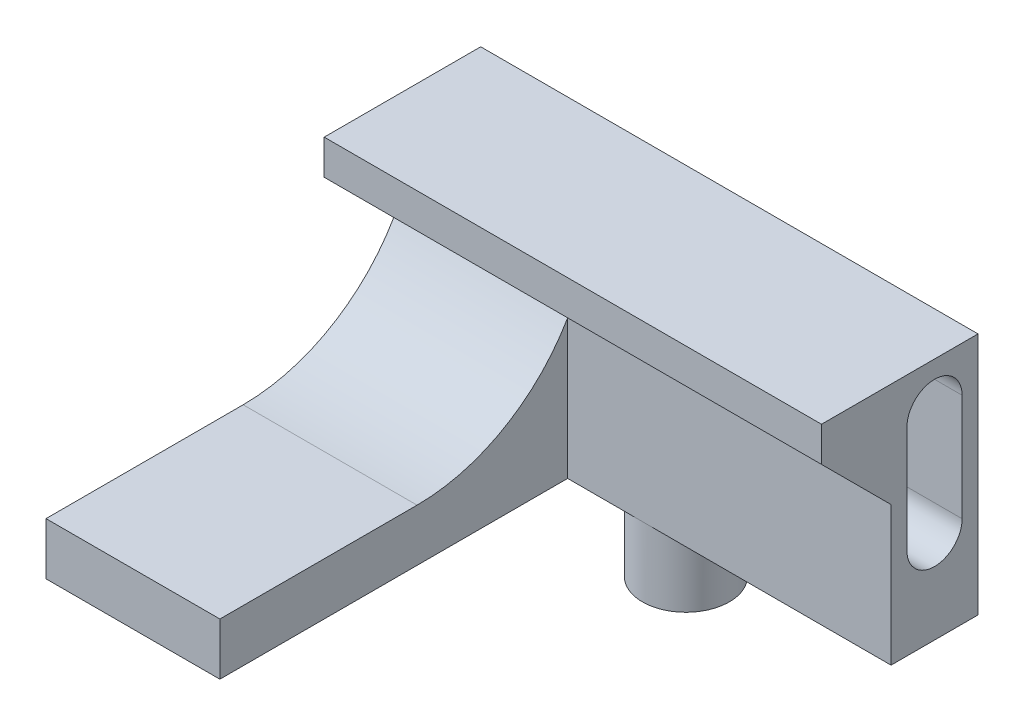
ISO-10303-21;
HEADER;
FILE_DESCRIPTION(('STEP AP214'),'2;1');
FILE_NAME('part.step','',(''),(''),'','','');
FILE_SCHEMA(('AUTOMOTIVE_DESIGN { 1 0 10303 214 1 1 1 1 }'));
ENDSEC;
DATA;
#1=APPLICATION_CONTEXT('core data for automotive mechanical design processes');
#2=APPLICATION_PROTOCOL_DEFINITION('international standard','automotive_design',2000,#1);
#3=PRODUCT_CONTEXT('',#1,'mechanical');
#4=PRODUCT('Part','Part','',(#3));
#5=PRODUCT_RELATED_PRODUCT_CATEGORY('part','',(#4));
#6=PRODUCT_DEFINITION_FORMATION('','',#4);
#7=PRODUCT_DEFINITION_CONTEXT('part definition',#1,'design');
#8=PRODUCT_DEFINITION('design','',#6,#7);
#9=PRODUCT_DEFINITION_SHAPE('','',#8);
#10=(LENGTH_UNIT() NAMED_UNIT(*) SI_UNIT(.MILLI.,.METRE.));
#11=(NAMED_UNIT(*) PLANE_ANGLE_UNIT() SI_UNIT($,.RADIAN.));
#12=(NAMED_UNIT(*) SI_UNIT($,.STERADIAN.) SOLID_ANGLE_UNIT());
#13=UNCERTAINTY_MEASURE_WITH_UNIT(LENGTH_MEASURE(1.E-05),#10,'distance_accuracy_value','');
#14=(GEOMETRIC_REPRESENTATION_CONTEXT(3) GLOBAL_UNCERTAINTY_ASSIGNED_CONTEXT((#13)) GLOBAL_UNIT_ASSIGNED_CONTEXT((#10,
#11,#12)) REPRESENTATION_CONTEXT('',''));
#15=CARTESIAN_POINT('',(0.,0.,0.));
#16=DIRECTION('',(0.,0.,1.));
#17=DIRECTION('',(1.,0.,0.));
#18=AXIS2_PLACEMENT_3D('',#15,#16,#17);
#19=CARTESIAN_POINT('',(-14.3,14.,2.5));
#20=DIRECTION('',(-1.,0.,0.));
#21=DIRECTION('',(0.,0.,1.));
#22=AXIS2_PLACEMENT_3D('',#19,#20,#21);
#23=PLANE('',#22);
#24=DIRECTION('',(0.,0.,-1.));
#25=VECTOR('',#24,1.);
#26=CARTESIAN_POINT('',(-14.3,0.,2.5));
#27=LINE('',#26,#25);
#28=CARTESIAN_POINT('',(-14.3,0.,22.5));
#29=VERTEX_POINT('',#28);
#30=CARTESIAN_POINT('',(-14.3,0.,-2.5));
#31=VERTEX_POINT('',#30);
#32=EDGE_CURVE('E273',#29,#31,#27,.T.);
#33=ORIENTED_EDGE('',*,*,#32,.F.);
#34=DIRECTION('',(0.,1.,0.));
#35=VECTOR('',#34,1.);
#36=CARTESIAN_POINT('',(-14.3,0.,22.5));
#37=LINE('',#36,#35);
#38=CARTESIAN_POINT('',(-14.3,3.,22.5));
#39=VERTEX_POINT('',#38);
#40=EDGE_CURVE('E181',#29,#39,#37,.T.);
#41=ORIENTED_EDGE('',*,*,#40,.T.);
#42=DIRECTION('',(0.,0.,-1.));
#43=VECTOR('',#42,1.);
#44=CARTESIAN_POINT('',(-14.3,3.,22.5));
#45=LINE('',#44,#43);
#46=CARTESIAN_POINT('',(-14.3,3.,11.1602540378444));
#47=VERTEX_POINT('',#46);
#48=EDGE_CURVE('E165',#39,#47,#45,.T.);
#49=ORIENTED_EDGE('',*,*,#48,.T.);
#50=CARTESIAN_POINT('',(-14.3,13.,11.1602540378444));
#51=DIRECTION('',(-1.,0.,0.));
#52=DIRECTION('',(0.,0.,1.));
#53=AXIS2_PLACEMENT_3D('',#50,#51,#52);
#54=CIRCLE('',#53,10.);
#55=CARTESIAN_POINT('',(-14.3,7.99999999999996,2.5));
#56=VERTEX_POINT('',#55);
#57=EDGE_CURVE('E41',#47,#56,#54,.F.);
#58=ORIENTED_EDGE('',*,*,#57,.T.);
#59=DIRECTION('',(0.,-0.707106781186551,-0.707106781186544));
#60=VECTOR('',#59,1.);
#61=CARTESIAN_POINT('',(-14.3,12.,6.5));
#62=LINE('',#61,#60);
#63=CARTESIAN_POINT('',(-14.3,12.,6.5));
#64=VERTEX_POINT('',#63);
#65=EDGE_CURVE('E226',#64,#56,#62,.T.);
#66=ORIENTED_EDGE('',*,*,#65,.F.);
#67=DIRECTION('',(0.,-1.,0.));
#68=VECTOR('',#67,1.);
#69=CARTESIAN_POINT('',(-14.3,14.,6.5));
#70=LINE('',#69,#68);
#71=CARTESIAN_POINT('',(-14.3,14.,6.5));
#72=VERTEX_POINT('',#71);
#73=EDGE_CURVE('E231',#72,#64,#70,.T.);
#74=ORIENTED_EDGE('',*,*,#73,.F.);
#75=DIRECTION('',(0.,0.,-1.));
#76=VECTOR('',#75,1.);
#77=CARTESIAN_POINT('',(-14.3,14.,2.5));
#78=LINE('',#77,#76);
#79=CARTESIAN_POINT('',(-14.3,14.,-2.5));
#80=VERTEX_POINT('',#79);
#81=EDGE_CURVE('E280',#72,#80,#78,.T.);
#82=ORIENTED_EDGE('',*,*,#81,.T.);
#83=DIRECTION('',(0.,-1.,0.));
#84=VECTOR('',#83,1.);
#85=CARTESIAN_POINT('',(-14.3,14.,-2.5));
#86=LINE('',#85,#84);
#87=EDGE_CURVE('E289',#80,#31,#86,.T.);
#88=ORIENTED_EDGE('',*,*,#87,.T.);
#89=EDGE_LOOP('',(#33,#41,#49,#58,#66,#74,#82,#88));
#90=FACE_BOUND('',#89,.T.);
#91=DIRECTION('',(0.,-1.,0.));
#92=VECTOR('',#91,1.);
#93=CARTESIAN_POINT('',(-14.3,5.25,1.5875));
#94=LINE('',#93,#92);
#95=CARTESIAN_POINT('',(-14.3,11.4,1.5875));
#96=VERTEX_POINT('',#95);
#97=CARTESIAN_POINT('',(-14.3,5.25,1.5875));
#98=VERTEX_POINT('',#97);
#99=EDGE_CURVE('E202',#96,#98,#94,.T.);
#100=ORIENTED_EDGE('',*,*,#99,.T.);
#101=CARTESIAN_POINT('',(-14.3,5.25,0.));
#102=DIRECTION('',(1.,0.,0.));
#103=DIRECTION('',(0.,0.,-1.));
#104=AXIS2_PLACEMENT_3D('',#101,#102,#103);
#105=CIRCLE('',#104,1.5875);
#106=CARTESIAN_POINT('',(-14.3,5.25,-1.5875));
#107=VERTEX_POINT('',#106);
#108=EDGE_CURVE('E187',#98,#107,#105,.T.);
#109=ORIENTED_EDGE('',*,*,#108,.T.);
#110=DIRECTION('',(0.,1.,0.));
#111=VECTOR('',#110,1.);
#112=CARTESIAN_POINT('',(-14.3,5.25,-1.5875));
#113=LINE('',#112,#111);
#114=CARTESIAN_POINT('',(-14.3,11.4,-1.5875));
#115=VERTEX_POINT('',#114);
#116=EDGE_CURVE('E193',#107,#115,#113,.T.);
#117=ORIENTED_EDGE('',*,*,#116,.T.);
#118=CARTESIAN_POINT('',(-14.3,11.4,0.));
#119=DIRECTION('',(1.,0.,0.));
#120=DIRECTION('',(0.,0.,-1.));
#121=AXIS2_PLACEMENT_3D('',#118,#119,#120);
#122=CIRCLE('',#121,1.5875);
#123=EDGE_CURVE('E205',#115,#96,#122,.T.);
#124=ORIENTED_EDGE('',*,*,#123,.T.);
#125=EDGE_LOOP('',(#100,#109,#117,#124));
#126=FACE_BOUND('',#125,.T.);
#127=ADVANCED_FACE('F33',(#90,#126),#23,.T.);
#128=CARTESIAN_POINT('',(0.,0.,0.));
#129=DIRECTION('',(0.,-1.,0.));
#130=DIRECTION('',(0.,0.,-1.));
#131=AXIS2_PLACEMENT_3D('',#128,#129,#130);
#132=PLANE('',#131);
#133=CARTESIAN_POINT('',(0.,0.,0.));
#134=DIRECTION('',(0.,-1.,0.));
#135=DIRECTION('',(0.,0.,-1.));
#136=AXIS2_PLACEMENT_3D('',#133,#134,#135);
#137=CIRCLE('',#136,2.5);
#138=CARTESIAN_POINT('',(0.,0.,-2.5));
#139=VERTEX_POINT('',#138);
#140=CARTESIAN_POINT('',(0.,0.,2.5));
#141=VERTEX_POINT('',#140);
#142=EDGE_CURVE('E237',#139,#141,#137,.T.);
#143=ORIENTED_EDGE('',*,*,#142,.F.);
#144=DIRECTION('',(1.,0.,0.));
#145=VECTOR('',#144,1.);
#146=CARTESIAN_POINT('',(-14.3,0.,-2.5));
#147=LINE('',#146,#145);
#148=CARTESIAN_POINT('',(14.3,0.,-2.5));
#149=VERTEX_POINT('',#148);
#150=EDGE_CURVE('E292',#139,#149,#147,.T.);
#151=ORIENTED_EDGE('',*,*,#150,.T.);
#152=DIRECTION('',(0.,0.,-1.));
#153=VECTOR('',#152,1.);
#154=CARTESIAN_POINT('',(14.3,0.,2.5));
#155=LINE('',#154,#153);
#156=CARTESIAN_POINT('',(14.3,0.,2.5));
#157=VERTEX_POINT('',#156);
#158=EDGE_CURVE('E295',#157,#149,#155,.T.);
#159=ORIENTED_EDGE('',*,*,#158,.F.);
#160=DIRECTION('',(1.,0.,0.));
#161=VECTOR('',#160,1.);
#162=CARTESIAN_POINT('',(-14.3,0.,2.5));
#163=LINE('',#162,#161);
#164=EDGE_CURVE('E298',#141,#157,#163,.T.);
#165=ORIENTED_EDGE('',*,*,#164,.F.);
#166=EDGE_LOOP('',(#143,#151,#159,#165));
#167=FACE_BOUND('',#166,.T.);
#168=ADVANCED_FACE('F322',(#167),#132,.T.);
#169=CARTESIAN_POINT('',(-14.3,14.,2.5));
#170=DIRECTION('',(0.,0.,-1.));
#171=DIRECTION('',(-1.,0.,0.));
#172=AXIS2_PLACEMENT_3D('',#169,#170,#171);
#173=PLANE('',#172);
#174=DIRECTION('',(1.,0.,0.));
#175=VECTOR('',#174,1.);
#176=CARTESIAN_POINT('',(-21.511102550928,7.99999999999996,2.5));
#177=LINE('',#176,#175);
#178=CARTESIAN_POINT('',(-4.3,7.99999999999996,2.5));
#179=VERTEX_POINT('',#178);
#180=CARTESIAN_POINT('',(14.3,7.99999999999996,2.5));
#181=VERTEX_POINT('',#180);
#182=EDGE_CURVE('E229',#179,#181,#177,.T.);
#183=ORIENTED_EDGE('',*,*,#182,.F.);
#184=DIRECTION('',(0.,1.,0.));
#185=VECTOR('',#184,1.);
#186=CARTESIAN_POINT('',(-4.3,0.,2.5));
#187=LINE('',#186,#185);
#188=CARTESIAN_POINT('',(-4.3,0.,2.5));
#189=VERTEX_POINT('',#188);
#190=EDGE_CURVE('E47',#189,#179,#187,.T.);
#191=ORIENTED_EDGE('',*,*,#190,.F.);
#192=EDGE_CURVE('E284',#189,#141,#163,.T.);
#193=ORIENTED_EDGE('',*,*,#192,.T.);
#194=ORIENTED_EDGE('',*,*,#164,.T.);
#195=DIRECTION('',(0.,-1.,0.));
#196=VECTOR('',#195,1.);
#197=CARTESIAN_POINT('',(14.3,14.,2.5));
#198=LINE('',#197,#196);
#199=EDGE_CURVE('E300',#181,#157,#198,.T.);
#200=ORIENTED_EDGE('',*,*,#199,.F.);
#201=EDGE_LOOP('',(#183,#191,#193,#194,#200));
#202=FACE_BOUND('',#201,.T.);
#203=ADVANCED_FACE('F328',(#202),#173,.F.);
#204=CARTESIAN_POINT('',(14.3,14.,2.5));
#205=DIRECTION('',(-1.,0.,0.));
#206=DIRECTION('',(0.,0.,1.));
#207=AXIS2_PLACEMENT_3D('',#204,#205,#206);
#208=PLANE('',#207);
#209=DIRECTION('',(0.,1.,0.));
#210=VECTOR('',#209,1.);
#211=CARTESIAN_POINT('',(14.3,5.25,-1.5875));
#212=LINE('',#211,#210);
#213=CARTESIAN_POINT('',(14.3,5.25,-1.5875));
#214=VERTEX_POINT('',#213);
#215=CARTESIAN_POINT('',(14.3,11.4,-1.5875));
#216=VERTEX_POINT('',#215);
#217=EDGE_CURVE('E263',#214,#216,#212,.T.);
#218=ORIENTED_EDGE('',*,*,#217,.F.);
#219=CARTESIAN_POINT('',(14.3,5.25,0.));
#220=DIRECTION('',(1.,0.,0.));
#221=DIRECTION('',(0.,0.,-1.));
#222=AXIS2_PLACEMENT_3D('',#219,#220,#221);
#223=CIRCLE('',#222,1.5875);
#224=CARTESIAN_POINT('',(14.3,5.25,1.5875));
#225=VERTEX_POINT('',#224);
#226=EDGE_CURVE('E244',#225,#214,#223,.T.);
#227=ORIENTED_EDGE('',*,*,#226,.F.);
#228=DIRECTION('',(0.,-1.,0.));
#229=VECTOR('',#228,1.);
#230=CARTESIAN_POINT('',(14.3,5.25,1.5875));
#231=LINE('',#230,#229);
#232=CARTESIAN_POINT('',(14.3,11.4,1.5875));
#233=VERTEX_POINT('',#232);
#234=EDGE_CURVE('E252',#233,#225,#231,.T.);
#235=ORIENTED_EDGE('',*,*,#234,.F.);
#236=CARTESIAN_POINT('',(14.3,11.4,0.));
#237=DIRECTION('',(1.,0.,0.));
#238=DIRECTION('',(0.,0.,-1.));
#239=AXIS2_PLACEMENT_3D('',#236,#237,#238);
#240=CIRCLE('',#239,1.5875);
#241=EDGE_CURVE('E266',#216,#233,#240,.T.);
#242=ORIENTED_EDGE('',*,*,#241,.F.);
#243=EDGE_LOOP('',(#218,#227,#235,#242));
#244=FACE_BOUND('',#243,.T.);
#245=ORIENTED_EDGE('',*,*,#158,.T.);
#246=DIRECTION('',(0.,-1.,0.));
#247=VECTOR('',#246,1.);
#248=CARTESIAN_POINT('',(14.3,14.,-2.5));
#249=LINE('',#248,#247);
#250=CARTESIAN_POINT('',(14.3,14.,-2.5));
#251=VERTEX_POINT('',#250);
#252=EDGE_CURVE('E302',#251,#149,#249,.T.);
#253=ORIENTED_EDGE('',*,*,#252,.F.);
#254=DIRECTION('',(0.,0.,-1.));
#255=VECTOR('',#254,1.);
#256=CARTESIAN_POINT('',(14.3,14.,2.5));
#257=LINE('',#256,#255);
#258=CARTESIAN_POINT('',(14.3,14.,6.5));
#259=VERTEX_POINT('',#258);
#260=EDGE_CURVE('E287',#259,#251,#257,.T.);
#261=ORIENTED_EDGE('',*,*,#260,.F.);
#262=DIRECTION('',(0.,-1.,0.));
#263=VECTOR('',#262,1.);
#264=CARTESIAN_POINT('',(14.3,14.,6.5));
#265=LINE('',#264,#263);
#266=CARTESIAN_POINT('',(14.3,12.,6.5));
#267=VERTEX_POINT('',#266);
#268=EDGE_CURVE('E213',#259,#267,#265,.T.);
#269=ORIENTED_EDGE('',*,*,#268,.T.);
#270=DIRECTION('',(0.,-0.707106781186551,-0.707106781186544));
#271=VECTOR('',#270,1.);
#272=CARTESIAN_POINT('',(14.3,12.,6.5));
#273=LINE('',#272,#271);
#274=EDGE_CURVE('E220',#267,#181,#273,.T.);
#275=ORIENTED_EDGE('',*,*,#274,.T.);
#276=ORIENTED_EDGE('',*,*,#199,.T.);
#277=EDGE_LOOP('',(#245,#253,#261,#269,#275,#276));
#278=FACE_BOUND('',#277,.T.);
#279=ADVANCED_FACE('F337',(#244,#278),#208,.F.);
#280=CARTESIAN_POINT('',(-14.3,14.,-2.5));
#281=DIRECTION('',(0.,0.,-1.));
#282=DIRECTION('',(-1.,0.,0.));
#283=AXIS2_PLACEMENT_3D('',#280,#281,#282);
#284=PLANE('',#283);
#285=EDGE_CURVE('E293',#31,#139,#147,.T.);
#286=ORIENTED_EDGE('',*,*,#285,.F.);
#287=ORIENTED_EDGE('',*,*,#87,.F.);
#288=DIRECTION('',(1.,0.,0.));
#289=VECTOR('',#288,1.);
#290=CARTESIAN_POINT('',(-14.3,14.,-2.5));
#291=LINE('',#290,#289);
#292=EDGE_CURVE('E283',#80,#251,#291,.T.);
#293=ORIENTED_EDGE('',*,*,#292,.T.);
#294=ORIENTED_EDGE('',*,*,#252,.T.);
#295=ORIENTED_EDGE('',*,*,#150,.F.);
#296=EDGE_LOOP('',(#286,#287,#293,#294,#295));
#297=FACE_BOUND('',#296,.T.);
#298=ADVANCED_FACE('F333',(#297),#284,.T.);
#299=CARTESIAN_POINT('',(0.,14.,0.));
#300=DIRECTION('',(0.,-1.,0.));
#301=DIRECTION('',(0.,0.,-1.));
#302=AXIS2_PLACEMENT_3D('',#299,#300,#301);
#303=PLANE('',#302);
#304=ORIENTED_EDGE('',*,*,#81,.F.);
#305=DIRECTION('',(1.,0.,0.));
#306=VECTOR('',#305,1.);
#307=CARTESIAN_POINT('',(-21.511102550928,14.,6.5));
#308=LINE('',#307,#306);
#309=EDGE_CURVE('E223',#72,#259,#308,.T.);
#310=ORIENTED_EDGE('',*,*,#309,.T.);
#311=ORIENTED_EDGE('',*,*,#260,.T.);
#312=ORIENTED_EDGE('',*,*,#292,.F.);
#313=EDGE_LOOP('',(#304,#310,#311,#312));
#314=FACE_BOUND('',#313,.T.);
#315=ADVANCED_FACE('F336',(#314),#303,.F.);
#316=EDGE_CURVE('E247',#141,#139,#137,.T.);
#317=ORIENTED_EDGE('',*,*,#316,.F.);
#318=ORIENTED_EDGE('',*,*,#192,.F.);
#319=DIRECTION('',(0.,0.,1.));
#320=VECTOR('',#319,1.);
#321=CARTESIAN_POINT('',(-4.3,0.,2.5));
#322=LINE('',#321,#320);
#323=CARTESIAN_POINT('',(-4.3,0.,22.5));
#324=VERTEX_POINT('',#323);
#325=EDGE_CURVE('E171',#189,#324,#322,.T.);
#326=ORIENTED_EDGE('',*,*,#325,.T.);
#327=DIRECTION('',(-1.,0.,0.));
#328=VECTOR('',#327,1.);
#329=CARTESIAN_POINT('',(-4.3,0.,22.5));
#330=LINE('',#329,#328);
#331=EDGE_CURVE('E170',#324,#29,#330,.T.);
#332=ORIENTED_EDGE('',*,*,#331,.T.);
#333=ORIENTED_EDGE('',*,*,#32,.T.);
#334=ORIENTED_EDGE('',*,*,#285,.T.);
#335=EDGE_LOOP('',(#317,#318,#326,#332,#333,#334));
#336=FACE_BOUND('',#335,.T.);
#337=ADVANCED_FACE('F331',(#336),#132,.T.);
#338=CARTESIAN_POINT('',(10.3,5.25,0.));
#339=DIRECTION('',(1.,0.,0.));
#340=DIRECTION('',(0.,0.,-1.));
#341=AXIS2_PLACEMENT_3D('',#338,#339,#340);
#342=CYLINDRICAL_SURFACE('',#341,1.5875);
#343=ORIENTED_EDGE('',*,*,#226,.T.);
#344=DIRECTION('',(1.,0.,0.));
#345=VECTOR('',#344,1.);
#346=CARTESIAN_POINT('',(10.3,5.25,-1.5875));
#347=LINE('',#346,#345);
#348=CARTESIAN_POINT('',(10.3,5.25,-1.5875));
#349=VERTEX_POINT('',#348);
#350=EDGE_CURVE('E261',#349,#214,#347,.T.);
#351=ORIENTED_EDGE('',*,*,#350,.F.);
#352=CARTESIAN_POINT('',(10.3,5.25,0.));
#353=DIRECTION('',(1.,0.,0.));
#354=DIRECTION('',(0.,0.,-1.));
#355=AXIS2_PLACEMENT_3D('',#352,#353,#354);
#356=CIRCLE('',#355,1.5875);
#357=CARTESIAN_POINT('',(10.3,5.25,1.5875));
#358=VERTEX_POINT('',#357);
#359=EDGE_CURVE('E248',#358,#349,#356,.T.);
#360=ORIENTED_EDGE('',*,*,#359,.F.);
#361=DIRECTION('',(1.,0.,0.));
#362=VECTOR('',#361,1.);
#363=CARTESIAN_POINT('',(10.3,5.25,1.5875));
#364=LINE('',#363,#362);
#365=EDGE_CURVE('E271',#358,#225,#364,.T.);
#366=ORIENTED_EDGE('',*,*,#365,.T.);
#367=EDGE_LOOP('',(#343,#351,#360,#366));
#368=FACE_BOUND('',#367,.T.);
#369=ADVANCED_FACE('F345',(#368),#342,.F.);
#370=CARTESIAN_POINT('',(10.3,5.25,1.5875));
#371=DIRECTION('',(0.,0.,1.));
#372=DIRECTION('',(0.,-1.,0.));
#373=AXIS2_PLACEMENT_3D('',#370,#371,#372);
#374=PLANE('',#373);
#375=ORIENTED_EDGE('',*,*,#234,.T.);
#376=ORIENTED_EDGE('',*,*,#365,.F.);
#377=DIRECTION('',(0.,-1.,0.));
#378=VECTOR('',#377,1.);
#379=CARTESIAN_POINT('',(10.3,5.25,1.5875));
#380=LINE('',#379,#378);
#381=CARTESIAN_POINT('',(10.3,11.4,1.5875));
#382=VERTEX_POINT('',#381);
#383=EDGE_CURVE('E258',#382,#358,#380,.T.);
#384=ORIENTED_EDGE('',*,*,#383,.F.);
#385=DIRECTION('',(1.,0.,0.));
#386=VECTOR('',#385,1.);
#387=CARTESIAN_POINT('',(10.3,11.4,1.5875));
#388=LINE('',#387,#386);
#389=EDGE_CURVE('E274',#382,#233,#388,.T.);
#390=ORIENTED_EDGE('',*,*,#389,.T.);
#391=EDGE_LOOP('',(#375,#376,#384,#390));
#392=FACE_BOUND('',#391,.T.);
#393=ADVANCED_FACE('F352',(#392),#374,.F.);
#394=CARTESIAN_POINT('',(10.3,11.4,0.));
#395=DIRECTION('',(1.,0.,0.));
#396=DIRECTION('',(0.,0.,-1.));
#397=AXIS2_PLACEMENT_3D('',#394,#395,#396);
#398=CYLINDRICAL_SURFACE('',#397,1.5875);
#399=ORIENTED_EDGE('',*,*,#241,.T.);
#400=ORIENTED_EDGE('',*,*,#389,.F.);
#401=CARTESIAN_POINT('',(10.3,11.4,0.));
#402=DIRECTION('',(1.,0.,0.));
#403=DIRECTION('',(0.,0.,-1.));
#404=AXIS2_PLACEMENT_3D('',#401,#402,#403);
#405=CIRCLE('',#404,1.5875);
#406=CARTESIAN_POINT('',(10.3,11.4,-1.5875));
#407=VERTEX_POINT('',#406);
#408=EDGE_CURVE('E255',#407,#382,#405,.T.);
#409=ORIENTED_EDGE('',*,*,#408,.F.);
#410=DIRECTION('',(1.,0.,0.));
#411=VECTOR('',#410,1.);
#412=CARTESIAN_POINT('',(10.3,11.4,-1.5875));
#413=LINE('',#412,#411);
#414=EDGE_CURVE('E276',#407,#216,#413,.T.);
#415=ORIENTED_EDGE('',*,*,#414,.T.);
#416=EDGE_LOOP('',(#399,#400,#409,#415));
#417=FACE_BOUND('',#416,.T.);
#418=ADVANCED_FACE('F358',(#417),#398,.F.);
#419=CARTESIAN_POINT('',(10.3,5.25,-1.5875));
#420=DIRECTION('',(0.,0.,-1.));
#421=DIRECTION('',(0.,1.,0.));
#422=AXIS2_PLACEMENT_3D('',#419,#420,#421);
#423=PLANE('',#422);
#424=ORIENTED_EDGE('',*,*,#217,.T.);
#425=ORIENTED_EDGE('',*,*,#414,.F.);
#426=DIRECTION('',(0.,1.,0.));
#427=VECTOR('',#426,1.);
#428=CARTESIAN_POINT('',(10.3,5.25,-1.5875));
#429=LINE('',#428,#427);
#430=EDGE_CURVE('E251',#349,#407,#429,.T.);
#431=ORIENTED_EDGE('',*,*,#430,.F.);
#432=ORIENTED_EDGE('',*,*,#350,.T.);
#433=EDGE_LOOP('',(#424,#425,#431,#432));
#434=FACE_BOUND('',#433,.T.);
#435=ADVANCED_FACE('F354',(#434),#423,.F.);
#436=CARTESIAN_POINT('',(10.3,5.25,0.));
#437=DIRECTION('',(1.,0.,0.));
#438=DIRECTION('',(0.,0.,-1.));
#439=AXIS2_PLACEMENT_3D('',#436,#437,#438);
#440=PLANE('',#439);
#441=ORIENTED_EDGE('',*,*,#359,.T.);
#442=ORIENTED_EDGE('',*,*,#430,.T.);
#443=ORIENTED_EDGE('',*,*,#408,.T.);
#444=ORIENTED_EDGE('',*,*,#383,.T.);
#445=EDGE_LOOP('',(#441,#442,#443,#444));
#446=FACE_BOUND('',#445,.T.);
#447=ADVANCED_FACE('F357',(#446),#440,.T.);
#448=CARTESIAN_POINT('',(0.,-4.,0.));
#449=DIRECTION('',(0.,1.,0.));
#450=DIRECTION('',(0.,0.,1.));
#451=AXIS2_PLACEMENT_3D('',#448,#449,#450);
#452=CYLINDRICAL_SURFACE('',#451,2.5);
#453=CARTESIAN_POINT('',(0.,-4.,0.));
#454=DIRECTION('',(0.,-1.,0.));
#455=DIRECTION('',(0.,0.,-1.));
#456=AXIS2_PLACEMENT_3D('',#453,#454,#455);
#457=CIRCLE('',#456,2.5);
#458=CARTESIAN_POINT('',(0.,-4.,-2.5));
#459=VERTEX_POINT('',#458);
#460=EDGE_CURVE('E241',#459,#459,#457,.T.);
#461=ORIENTED_EDGE('',*,*,#460,.F.);
#462=EDGE_LOOP('',(#461));
#463=FACE_BOUND('',#462,.T.);
#464=ORIENTED_EDGE('',*,*,#142,.T.);
#465=ORIENTED_EDGE('',*,*,#316,.T.);
#466=EDGE_LOOP('',(#464,#465));
#467=FACE_BOUND('',#466,.T.);
#468=ADVANCED_FACE('F368',(#463,#467),#452,.T.);
#469=CARTESIAN_POINT('',(0.,-4.,0.));
#470=DIRECTION('',(0.,-1.,0.));
#471=DIRECTION('',(0.,0.,-1.));
#472=AXIS2_PLACEMENT_3D('',#469,#470,#471);
#473=PLANE('',#472);
#474=ORIENTED_EDGE('',*,*,#460,.T.);
#475=EDGE_LOOP('',(#474));
#476=FACE_BOUND('',#475,.T.);
#477=ADVANCED_FACE('F372',(#476),#473,.T.);
#478=CARTESIAN_POINT('',(-21.511102550928,14.,6.5));
#479=DIRECTION('',(0.,0.,1.));
#480=DIRECTION('',(1.,0.,0.));
#481=AXIS2_PLACEMENT_3D('',#478,#479,#480);
#482=PLANE('',#481);
#483=ORIENTED_EDGE('',*,*,#309,.F.);
#484=ORIENTED_EDGE('',*,*,#73,.T.);
#485=DIRECTION('',(1.,0.,0.));
#486=VECTOR('',#485,1.);
#487=CARTESIAN_POINT('',(-21.511102550928,12.,6.5));
#488=LINE('',#487,#486);
#489=EDGE_CURVE('E230',#64,#267,#488,.T.);
#490=ORIENTED_EDGE('',*,*,#489,.T.);
#491=ORIENTED_EDGE('',*,*,#268,.F.);
#492=EDGE_LOOP('',(#483,#484,#490,#491));
#493=FACE_BOUND('',#492,.T.);
#494=ADVANCED_FACE('F376',(#493),#482,.T.);
#495=CARTESIAN_POINT('',(-21.511102550928,12.,6.5));
#496=DIRECTION('',(0.,-0.707106781186544,0.707106781186551));
#497=DIRECTION('',(0.,-0.707106781186551,-0.707106781186544));
#498=AXIS2_PLACEMENT_3D('',#495,#496,#497);
#499=PLANE('',#498);
#500=ORIENTED_EDGE('',*,*,#489,.F.);
#501=ORIENTED_EDGE('',*,*,#65,.T.);
#502=EDGE_CURVE('E234',#56,#179,#177,.T.);
#503=ORIENTED_EDGE('',*,*,#502,.T.);
#504=ORIENTED_EDGE('',*,*,#182,.T.);
#505=ORIENTED_EDGE('',*,*,#274,.F.);
#506=EDGE_LOOP('',(#500,#501,#503,#504,#505));
#507=FACE_BOUND('',#506,.T.);
#508=ADVANCED_FACE('F314',(#507),#499,.T.);
#509=CARTESIAN_POINT('',(-10.3,5.25,0.));
#510=DIRECTION('',(-1.,0.,0.));
#511=DIRECTION('',(0.,0.,1.));
#512=AXIS2_PLACEMENT_3D('',#509,#510,#511);
#513=CYLINDRICAL_SURFACE('',#512,1.5875);
#514=ORIENTED_EDGE('',*,*,#108,.F.);
#515=DIRECTION('',(-1.,0.,0.));
#516=VECTOR('',#515,1.);
#517=CARTESIAN_POINT('',(-10.3,5.25,1.5875));
#518=LINE('',#517,#516);
#519=CARTESIAN_POINT('',(-10.3,5.25,1.5875));
#520=VERTEX_POINT('',#519);
#521=EDGE_CURVE('E199',#520,#98,#518,.T.);
#522=ORIENTED_EDGE('',*,*,#521,.F.);
#523=CARTESIAN_POINT('',(-10.3,5.25,0.));
#524=DIRECTION('',(1.,0.,0.));
#525=DIRECTION('',(0.,0.,-1.));
#526=AXIS2_PLACEMENT_3D('',#523,#524,#525);
#527=CIRCLE('',#526,1.5875);
#528=CARTESIAN_POINT('',(-10.3,5.25,-1.5875));
#529=VERTEX_POINT('',#528);
#530=EDGE_CURVE('E189',#520,#529,#527,.T.);
#531=ORIENTED_EDGE('',*,*,#530,.T.);
#532=DIRECTION('',(-1.,0.,0.));
#533=VECTOR('',#532,1.);
#534=CARTESIAN_POINT('',(-10.3,5.25,-1.5875));
#535=LINE('',#534,#533);
#536=EDGE_CURVE('E210',#529,#107,#535,.T.);
#537=ORIENTED_EDGE('',*,*,#536,.T.);
#538=EDGE_LOOP('',(#514,#522,#531,#537));
#539=FACE_BOUND('',#538,.T.);
#540=ADVANCED_FACE('F383',(#539),#513,.F.);
#541=CARTESIAN_POINT('',(-10.3,5.25,-1.5875));
#542=DIRECTION('',(0.,0.,1.));
#543=DIRECTION('',(0.,-1.,0.));
#544=AXIS2_PLACEMENT_3D('',#541,#542,#543);
#545=PLANE('',#544);
#546=ORIENTED_EDGE('',*,*,#116,.F.);
#547=ORIENTED_EDGE('',*,*,#536,.F.);
#548=DIRECTION('',(0.,1.,0.));
#549=VECTOR('',#548,1.);
#550=CARTESIAN_POINT('',(-10.3,5.25,-1.5875));
#551=LINE('',#550,#549);
#552=CARTESIAN_POINT('',(-10.3,11.4,-1.5875));
#553=VERTEX_POINT('',#552);
#554=EDGE_CURVE('E197',#529,#553,#551,.T.);
#555=ORIENTED_EDGE('',*,*,#554,.T.);
#556=DIRECTION('',(-1.,0.,0.));
#557=VECTOR('',#556,1.);
#558=CARTESIAN_POINT('',(-10.3,11.4,-1.5875));
#559=LINE('',#558,#557);
#560=EDGE_CURVE('E214',#553,#115,#559,.T.);
#561=ORIENTED_EDGE('',*,*,#560,.T.);
#562=EDGE_LOOP('',(#546,#547,#555,#561));
#563=FACE_BOUND('',#562,.T.);
#564=ADVANCED_FACE('F386',(#563),#545,.T.);
#565=CARTESIAN_POINT('',(-10.3,11.4,0.));
#566=DIRECTION('',(-1.,0.,0.));
#567=DIRECTION('',(0.,0.,1.));
#568=AXIS2_PLACEMENT_3D('',#565,#566,#567);
#569=CYLINDRICAL_SURFACE('',#568,1.5875);
#570=ORIENTED_EDGE('',*,*,#123,.F.);
#571=ORIENTED_EDGE('',*,*,#560,.F.);
#572=CARTESIAN_POINT('',(-10.3,11.4,0.));
#573=DIRECTION('',(1.,0.,0.));
#574=DIRECTION('',(0.,0.,-1.));
#575=AXIS2_PLACEMENT_3D('',#572,#573,#574);
#576=CIRCLE('',#575,1.5875);
#577=CARTESIAN_POINT('',(-10.3,11.4,1.5875));
#578=VERTEX_POINT('',#577);
#579=EDGE_CURVE('E195',#553,#578,#576,.T.);
#580=ORIENTED_EDGE('',*,*,#579,.T.);
#581=DIRECTION('',(-1.,0.,0.));
#582=VECTOR('',#581,1.);
#583=CARTESIAN_POINT('',(-10.3,11.4,1.5875));
#584=LINE('',#583,#582);
#585=EDGE_CURVE('E216',#578,#96,#584,.T.);
#586=ORIENTED_EDGE('',*,*,#585,.T.);
#587=EDGE_LOOP('',(#570,#571,#580,#586));
#588=FACE_BOUND('',#587,.T.);
#589=ADVANCED_FACE('F392',(#588),#569,.F.);
#590=CARTESIAN_POINT('',(-10.3,5.25,1.5875));
#591=DIRECTION('',(0.,0.,-1.));
#592=DIRECTION('',(0.,1.,0.));
#593=AXIS2_PLACEMENT_3D('',#590,#591,#592);
#594=PLANE('',#593);
#595=ORIENTED_EDGE('',*,*,#99,.F.);
#596=ORIENTED_EDGE('',*,*,#585,.F.);
#597=DIRECTION('',(0.,-1.,0.));
#598=VECTOR('',#597,1.);
#599=CARTESIAN_POINT('',(-10.3,5.25,1.5875));
#600=LINE('',#599,#598);
#601=EDGE_CURVE('E192',#578,#520,#600,.T.);
#602=ORIENTED_EDGE('',*,*,#601,.T.);
#603=ORIENTED_EDGE('',*,*,#521,.T.);
#604=EDGE_LOOP('',(#595,#596,#602,#603));
#605=FACE_BOUND('',#604,.T.);
#606=ADVANCED_FACE('F388',(#605),#594,.T.);
#607=CARTESIAN_POINT('',(-10.3,5.25,0.));
#608=DIRECTION('',(-1.,0.,0.));
#609=DIRECTION('',(0.,0.,-1.));
#610=AXIS2_PLACEMENT_3D('',#607,#608,#609);
#611=PLANE('',#610);
#612=ORIENTED_EDGE('',*,*,#530,.F.);
#613=ORIENTED_EDGE('',*,*,#601,.F.);
#614=ORIENTED_EDGE('',*,*,#579,.F.);
#615=ORIENTED_EDGE('',*,*,#554,.F.);
#616=EDGE_LOOP('',(#612,#613,#614,#615));
#617=FACE_BOUND('',#616,.T.);
#618=ADVANCED_FACE('F391',(#617),#611,.T.);
#619=CARTESIAN_POINT('',(-4.3,0.,22.5));
#620=DIRECTION('',(0.,0.,1.));
#621=DIRECTION('',(1.,0.,0.));
#622=AXIS2_PLACEMENT_3D('',#619,#620,#621);
#623=PLANE('',#622);
#624=ORIENTED_EDGE('',*,*,#40,.F.);
#625=ORIENTED_EDGE('',*,*,#331,.F.);
#626=DIRECTION('',(0.,1.,0.));
#627=VECTOR('',#626,1.);
#628=CARTESIAN_POINT('',(-4.3,0.,22.5));
#629=LINE('',#628,#627);
#630=CARTESIAN_POINT('',(-4.3,3.,22.5));
#631=VERTEX_POINT('',#630);
#632=EDGE_CURVE('E175',#324,#631,#629,.T.);
#633=ORIENTED_EDGE('',*,*,#632,.T.);
#634=DIRECTION('',(-1.,0.,0.));
#635=VECTOR('',#634,1.);
#636=CARTESIAN_POINT('',(-4.3,3.,22.5));
#637=LINE('',#636,#635);
#638=EDGE_CURVE('E159',#631,#39,#637,.T.);
#639=ORIENTED_EDGE('',*,*,#638,.T.);
#640=EDGE_LOOP('',(#624,#625,#633,#639));
#641=FACE_BOUND('',#640,.T.);
#642=ADVANCED_FACE('F178',(#641),#623,.T.);
#643=CARTESIAN_POINT('',(-4.3,3.,22.5));
#644=DIRECTION('',(0.,1.,0.));
#645=DIRECTION('',(0.,0.,1.));
#646=AXIS2_PLACEMENT_3D('',#643,#644,#645);
#647=PLANE('',#646);
#648=DIRECTION('',(0.,0.,-1.));
#649=VECTOR('',#648,1.);
#650=CARTESIAN_POINT('',(-4.3,3.,22.5));
#651=LINE('',#650,#649);
#652=CARTESIAN_POINT('',(-4.3,3.,11.1602540378444));
#653=VERTEX_POINT('',#652);
#654=EDGE_CURVE('E162',#631,#653,#651,.T.);
#655=ORIENTED_EDGE('',*,*,#654,.T.);
#656=DIRECTION('',(1.,0.,0.));
#657=VECTOR('',#656,1.);
#658=CARTESIAN_POINT('',(-14.3,3.,11.1602540378444));
#659=LINE('',#658,#657);
#660=EDGE_CURVE('E306',#653,#47,#659,.F.);
#661=ORIENTED_EDGE('',*,*,#660,.T.);
#662=ORIENTED_EDGE('',*,*,#48,.F.);
#663=ORIENTED_EDGE('',*,*,#638,.F.);
#664=EDGE_LOOP('',(#655,#661,#662,#663));
#665=FACE_BOUND('',#664,.T.);
#666=ADVANCED_FACE('F160',(#665),#647,.T.);
#667=CARTESIAN_POINT('',(-4.3,0.,0.));
#668=DIRECTION('',(-1.,0.,0.));
#669=DIRECTION('',(0.,0.,1.));
#670=AXIS2_PLACEMENT_3D('',#667,#668,#669);
#671=PLANE('',#670);
#672=ORIENTED_EDGE('',*,*,#632,.F.);
#673=ORIENTED_EDGE('',*,*,#325,.F.);
#674=ORIENTED_EDGE('',*,*,#190,.T.);
#675=CARTESIAN_POINT('',(-4.3,13.,11.1602540378444));
#676=DIRECTION('',(-1.,0.,0.));
#677=DIRECTION('',(0.,0.,1.));
#678=AXIS2_PLACEMENT_3D('',#675,#676,#677);
#679=CIRCLE('',#678,10.);
#680=EDGE_CURVE('E11',#179,#653,#679,.T.);
#681=ORIENTED_EDGE('',*,*,#680,.T.);
#682=ORIENTED_EDGE('',*,*,#654,.F.);
#683=EDGE_LOOP('',(#672,#673,#674,#681,#682));
#684=FACE_BOUND('',#683,.T.);
#685=ADVANCED_FACE('F174',(#684),#671,.F.);
#686=CARTESIAN_POINT('',(-14.3,13.,11.1602540378444));
#687=DIRECTION('',(-1.,0.,0.));
#688=DIRECTION('',(0.,-1.,0.));
#689=AXIS2_PLACEMENT_3D('',#686,#687,#688);
#690=CYLINDRICAL_SURFACE('',#689,10.);
#691=ORIENTED_EDGE('',*,*,#680,.F.);
#692=ORIENTED_EDGE('',*,*,#502,.F.);
#693=ORIENTED_EDGE('',*,*,#57,.F.);
#694=ORIENTED_EDGE('',*,*,#660,.F.);
#695=EDGE_LOOP('',(#691,#692,#693,#694));
#696=FACE_BOUND('',#695,.T.);
#697=ADVANCED_FACE('F35',(#696),#690,.F.);
#698=CLOSED_SHELL('',(#127,#168,#203,#279,#298,#315,#337,#369,#393,#418,#435,#447,#468,#477,
#494,#508,#540,#564,#589,#606,#618,#642,#666,#685,#697));
#699=MANIFOLD_SOLID_BREP('B2',#698);
#700=ADVANCED_BREP_SHAPE_REPRESENTATION('',(#18,#699),#14);
#701=SHAPE_DEFINITION_REPRESENTATION(#9,#700);
ENDSEC;
END-ISO-10303-21;
